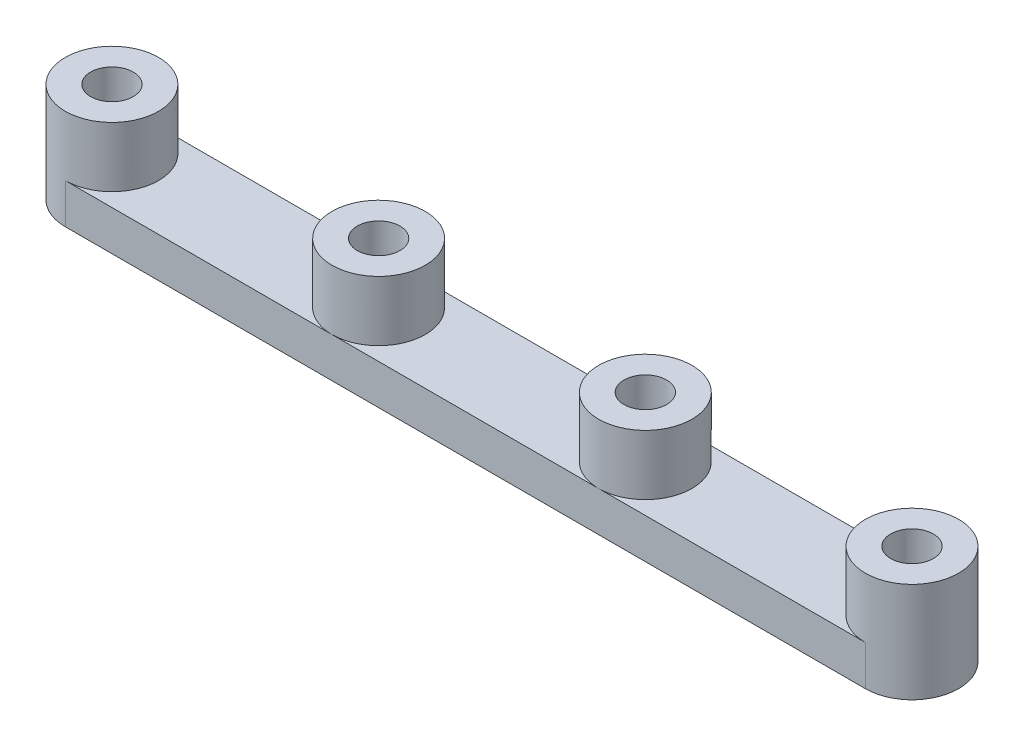
ISO-10303-21;
HEADER;
FILE_DESCRIPTION(('STEP AP214'),'2;1');
FILE_NAME('part.step','',(''),(''),'','','');
FILE_SCHEMA(('AUTOMOTIVE_DESIGN { 1 0 10303 214 1 1 1 1 }'));
ENDSEC;
DATA;
#1=APPLICATION_CONTEXT('core data for automotive mechanical design processes');
#2=APPLICATION_PROTOCOL_DEFINITION('international standard','automotive_design',2000,#1);
#3=PRODUCT_CONTEXT('',#1,'mechanical');
#4=PRODUCT('Part','Part','',(#3));
#5=PRODUCT_RELATED_PRODUCT_CATEGORY('part','',(#4));
#6=PRODUCT_DEFINITION_FORMATION('','',#4);
#7=PRODUCT_DEFINITION_CONTEXT('part definition',#1,'design');
#8=PRODUCT_DEFINITION('design','',#6,#7);
#9=PRODUCT_DEFINITION_SHAPE('','',#8);
#10=(LENGTH_UNIT() NAMED_UNIT(*) SI_UNIT(.MILLI.,.METRE.));
#11=(NAMED_UNIT(*) PLANE_ANGLE_UNIT() SI_UNIT($,.RADIAN.));
#12=(NAMED_UNIT(*) SI_UNIT($,.STERADIAN.) SOLID_ANGLE_UNIT());
#13=UNCERTAINTY_MEASURE_WITH_UNIT(LENGTH_MEASURE(1.E-05),#10,'distance_accuracy_value','');
#14=(GEOMETRIC_REPRESENTATION_CONTEXT(3) GLOBAL_UNCERTAINTY_ASSIGNED_CONTEXT((#13)) GLOBAL_UNIT_ASSIGNED_CONTEXT((#10,
#11,#12)) REPRESENTATION_CONTEXT('',''));
#15=CARTESIAN_POINT('',(0.,0.,0.));
#16=DIRECTION('',(0.,0.,1.));
#17=DIRECTION('',(1.,0.,0.));
#18=AXIS2_PLACEMENT_3D('',#15,#16,#17);
#19=CARTESIAN_POINT('',(30.,3.,0.));
#20=DIRECTION('',(0.,1.,0.));
#21=DIRECTION('',(0.,0.,1.));
#22=AXIS2_PLACEMENT_3D('',#19,#20,#21);
#23=PLANE('',#22);
#24=DIRECTION('',(1.,0.,0.));
#25=VECTOR('',#24,1.);
#26=CARTESIAN_POINT('',(30.,3.,3.49999999999999));
#27=LINE('',#26,#25);
#28=CARTESIAN_POINT('',(10.,3.,3.49999999999999));
#29=VERTEX_POINT('',#28);
#30=CARTESIAN_POINT('',(30.,3.,3.49999999999999));
#31=VERTEX_POINT('',#30);
#32=EDGE_CURVE('E112',#29,#31,#27,.T.);
#33=ORIENTED_EDGE('',*,*,#32,.T.);
#34=CARTESIAN_POINT('',(30.,3.,0.));
#35=DIRECTION('',(0.,1.,0.));
#36=DIRECTION('',(0.,0.,1.));
#37=AXIS2_PLACEMENT_3D('',#34,#35,#36);
#38=CIRCLE('',#37,3.5);
#39=CARTESIAN_POINT('',(30.,3.,-3.50000000000001));
#40=VERTEX_POINT('',#39);
#41=EDGE_CURVE('E100',#40,#31,#38,.T.);
#42=ORIENTED_EDGE('',*,*,#41,.F.);
#43=DIRECTION('',(-1.,0.,0.));
#44=VECTOR('',#43,1.);
#45=CARTESIAN_POINT('',(30.,3.,-3.50000000000001));
#46=LINE('',#45,#44);
#47=CARTESIAN_POINT('',(10.,3.,-3.5));
#48=VERTEX_POINT('',#47);
#49=EDGE_CURVE('E106',#40,#48,#46,.T.);
#50=ORIENTED_EDGE('',*,*,#49,.T.);
#51=CARTESIAN_POINT('',(10.,3.,0.));
#52=DIRECTION('',(0.,1.,0.));
#53=DIRECTION('',(0.,0.,1.));
#54=AXIS2_PLACEMENT_3D('',#51,#52,#53);
#55=CIRCLE('',#54,3.5);
#56=EDGE_CURVE('E137',#29,#48,#55,.T.);
#57=ORIENTED_EDGE('',*,*,#56,.F.);
#58=EDGE_LOOP('',(#33,#42,#50,#57));
#59=FACE_BOUND('',#58,.T.);
#60=ADVANCED_FACE('F41',(#59),#23,.T.);
#61=CARTESIAN_POINT('',(-9.99999999999999,3.,3.5));
#62=VERTEX_POINT('',#61);
#63=EDGE_CURVE('E183',#62,#29,#27,.T.);
#64=ORIENTED_EDGE('',*,*,#63,.T.);
#65=EDGE_CURVE('E56',#48,#29,#55,.T.);
#66=ORIENTED_EDGE('',*,*,#65,.F.);
#67=CARTESIAN_POINT('',(-10.,3.,-3.5));
#68=VERTEX_POINT('',#67);
#69=EDGE_CURVE('E109',#48,#68,#46,.T.);
#70=ORIENTED_EDGE('',*,*,#69,.T.);
#71=CARTESIAN_POINT('',(-10.,3.,0.));
#72=DIRECTION('',(0.,1.,0.));
#73=DIRECTION('',(0.,0.,1.));
#74=AXIS2_PLACEMENT_3D('',#71,#72,#73);
#75=CIRCLE('',#74,3.5);
#76=EDGE_CURVE('E148',#62,#68,#75,.T.);
#77=ORIENTED_EDGE('',*,*,#76,.F.);
#78=EDGE_LOOP('',(#64,#66,#70,#77));
#79=FACE_BOUND('',#78,.T.);
#80=ADVANCED_FACE('F222',(#79),#23,.T.);
#81=CARTESIAN_POINT('',(-30.,3.,3.5));
#82=VERTEX_POINT('',#81);
#83=EDGE_CURVE('E178',#82,#62,#27,.T.);
#84=ORIENTED_EDGE('',*,*,#83,.T.);
#85=EDGE_CURVE('E63',#68,#62,#75,.T.);
#86=ORIENTED_EDGE('',*,*,#85,.F.);
#87=CARTESIAN_POINT('',(-30.,3.,-3.5));
#88=VERTEX_POINT('',#87);
#89=EDGE_CURVE('E114',#68,#88,#46,.T.);
#90=ORIENTED_EDGE('',*,*,#89,.T.);
#91=CARTESIAN_POINT('',(-30.,3.,0.));
#92=DIRECTION('',(0.,1.,0.));
#93=DIRECTION('',(0.,0.,1.));
#94=AXIS2_PLACEMENT_3D('',#91,#92,#93);
#95=CIRCLE('',#94,3.5);
#96=EDGE_CURVE('E154',#82,#88,#95,.T.);
#97=ORIENTED_EDGE('',*,*,#96,.F.);
#98=EDGE_LOOP('',(#84,#86,#90,#97));
#99=FACE_BOUND('',#98,.T.);
#100=ADVANCED_FACE('F217',(#99),#23,.T.);
#101=CARTESIAN_POINT('',(30.,0.,0.));
#102=DIRECTION('',(0.,1.,0.));
#103=DIRECTION('',(0.,0.,1.));
#104=AXIS2_PLACEMENT_3D('',#101,#102,#103);
#105=PLANE('',#104);
#106=CARTESIAN_POINT('',(30.,0.,0.));
#107=DIRECTION('',(0.,1.,0.));
#108=DIRECTION('',(0.,0.,1.));
#109=AXIS2_PLACEMENT_3D('',#106,#107,#108);
#110=CIRCLE('',#109,3.5);
#111=CARTESIAN_POINT('',(30.,0.,3.49999999999999));
#112=VERTEX_POINT('',#111);
#113=CARTESIAN_POINT('',(30.,0.,-3.50000000000001));
#114=VERTEX_POINT('',#113);
#115=EDGE_CURVE('E102',#112,#114,#110,.T.);
#116=ORIENTED_EDGE('',*,*,#115,.F.);
#117=DIRECTION('',(1.,0.,0.));
#118=VECTOR('',#117,1.);
#119=CARTESIAN_POINT('',(30.,0.,3.49999999999999));
#120=LINE('',#119,#118);
#121=CARTESIAN_POINT('',(-30.,0.,3.50000000000001));
#122=VERTEX_POINT('',#121);
#123=EDGE_CURVE('E192',#122,#112,#120,.T.);
#124=ORIENTED_EDGE('',*,*,#123,.F.);
#125=CARTESIAN_POINT('',(-30.,0.,0.));
#126=DIRECTION('',(0.,1.,0.));
#127=DIRECTION('',(0.,0.,1.));
#128=AXIS2_PLACEMENT_3D('',#125,#126,#127);
#129=CIRCLE('',#128,3.5);
#130=CARTESIAN_POINT('',(-30.,0.,-3.5));
#131=VERTEX_POINT('',#130);
#132=EDGE_CURVE('E189',#131,#122,#129,.T.);
#133=ORIENTED_EDGE('',*,*,#132,.F.);
#134=DIRECTION('',(-1.,0.,0.));
#135=VECTOR('',#134,1.);
#136=CARTESIAN_POINT('',(30.,0.,-3.50000000000001));
#137=LINE('',#136,#135);
#138=EDGE_CURVE('E186',#114,#131,#137,.T.);
#139=ORIENTED_EDGE('',*,*,#138,.F.);
#140=EDGE_LOOP('',(#116,#124,#133,#139));
#141=FACE_BOUND('',#140,.T.);
#142=CARTESIAN_POINT('',(-30.,0.,0.));
#143=DIRECTION('',(0.,1.,0.));
#144=DIRECTION('',(0.,0.,1.));
#145=AXIS2_PLACEMENT_3D('',#142,#143,#144);
#146=CIRCLE('',#145,1.6);
#147=CARTESIAN_POINT('',(-30.,0.,1.6));
#148=VERTEX_POINT('',#147);
#149=EDGE_CURVE('E174',#148,#148,#146,.T.);
#150=ORIENTED_EDGE('',*,*,#149,.T.);
#151=EDGE_LOOP('',(#150));
#152=FACE_BOUND('',#151,.T.);
#153=CARTESIAN_POINT('',(-10.,0.,0.));
#154=DIRECTION('',(0.,1.,0.));
#155=DIRECTION('',(0.,0.,1.));
#156=AXIS2_PLACEMENT_3D('',#153,#154,#155);
#157=CIRCLE('',#156,1.6);
#158=CARTESIAN_POINT('',(-10.,0.,1.60000000000001));
#159=VERTEX_POINT('',#158);
#160=EDGE_CURVE('E170',#159,#159,#157,.T.);
#161=ORIENTED_EDGE('',*,*,#160,.T.);
#162=EDGE_LOOP('',(#161));
#163=FACE_BOUND('',#162,.T.);
#164=CARTESIAN_POINT('',(10.,0.,0.));
#165=DIRECTION('',(0.,1.,0.));
#166=DIRECTION('',(0.,0.,1.));
#167=AXIS2_PLACEMENT_3D('',#164,#165,#166);
#168=CIRCLE('',#167,1.6);
#169=CARTESIAN_POINT('',(10.,0.,1.6));
#170=VERTEX_POINT('',#169);
#171=EDGE_CURVE('E166',#170,#170,#168,.T.);
#172=ORIENTED_EDGE('',*,*,#171,.T.);
#173=EDGE_LOOP('',(#172));
#174=FACE_BOUND('',#173,.T.);
#175=CARTESIAN_POINT('',(30.,0.,0.));
#176=DIRECTION('',(0.,1.,0.));
#177=DIRECTION('',(0.,0.,1.));
#178=AXIS2_PLACEMENT_3D('',#175,#176,#177);
#179=CIRCLE('',#178,1.6);
#180=CARTESIAN_POINT('',(30.,0.,1.6));
#181=VERTEX_POINT('',#180);
#182=EDGE_CURVE('E159',#181,#181,#179,.T.);
#183=ORIENTED_EDGE('',*,*,#182,.T.);
#184=EDGE_LOOP('',(#183));
#185=FACE_BOUND('',#184,.T.);
#186=ADVANCED_FACE('F211',(#141,#152,#163,#174,#185),#105,.F.);
#187=CARTESIAN_POINT('',(30.,3.,0.));
#188=DIRECTION('',(0.,-1.,0.));
#189=DIRECTION('',(0.,0.,-1.));
#190=AXIS2_PLACEMENT_3D('',#187,#188,#189);
#191=CYLINDRICAL_SURFACE('',#190,3.5);
#192=ORIENTED_EDGE('',*,*,#115,.T.);
#193=DIRECTION('',(0.,-1.,0.));
#194=VECTOR('',#193,1.);
#195=CARTESIAN_POINT('',(30.,3.,-3.50000000000001));
#196=LINE('',#195,#194);
#197=EDGE_CURVE('E11',#40,#114,#196,.T.);
#198=ORIENTED_EDGE('',*,*,#197,.F.);
#199=ORIENTED_EDGE('',*,*,#41,.T.);
#200=DIRECTION('',(0.,-1.,0.));
#201=VECTOR('',#200,1.);
#202=CARTESIAN_POINT('',(30.,3.,3.49999999999999));
#203=LINE('',#202,#201);
#204=EDGE_CURVE('E182',#31,#112,#203,.T.);
#205=ORIENTED_EDGE('',*,*,#204,.T.);
#206=EDGE_LOOP('',(#192,#198,#199,#205));
#207=FACE_BOUND('',#206,.T.);
#208=CARTESIAN_POINT('',(30.,7.5,0.));
#209=DIRECTION('',(0.,1.,0.));
#210=DIRECTION('',(0.,0.,1.));
#211=AXIS2_PLACEMENT_3D('',#208,#209,#210);
#212=CIRCLE('',#211,3.5);
#213=CARTESIAN_POINT('',(30.,7.5,3.5));
#214=VERTEX_POINT('',#213);
#215=EDGE_CURVE('E118',#214,#214,#212,.T.);
#216=ORIENTED_EDGE('',*,*,#215,.F.);
#217=EDGE_LOOP('',(#216));
#218=FACE_BOUND('',#217,.T.);
#219=ADVANCED_FACE('F43',(#207,#218),#191,.T.);
#220=CARTESIAN_POINT('',(30.,3.,-3.50000000000001));
#221=DIRECTION('',(0.,0.,1.));
#222=DIRECTION('',(1.,0.,0.));
#223=AXIS2_PLACEMENT_3D('',#220,#221,#222);
#224=PLANE('',#223);
#225=ORIENTED_EDGE('',*,*,#138,.T.);
#226=DIRECTION('',(0.,-1.,0.));
#227=VECTOR('',#226,1.);
#228=CARTESIAN_POINT('',(-30.,3.,-3.5));
#229=LINE('',#228,#227);
#230=EDGE_CURVE('E50',#88,#131,#229,.T.);
#231=ORIENTED_EDGE('',*,*,#230,.F.);
#232=ORIENTED_EDGE('',*,*,#89,.F.);
#233=ORIENTED_EDGE('',*,*,#69,.F.);
#234=ORIENTED_EDGE('',*,*,#49,.F.);
#235=ORIENTED_EDGE('',*,*,#197,.T.);
#236=EDGE_LOOP('',(#225,#231,#232,#233,#234,#235));
#237=FACE_BOUND('',#236,.T.);
#238=ADVANCED_FACE('F107',(#237),#224,.F.);
#239=CARTESIAN_POINT('',(-30.,3.,0.));
#240=DIRECTION('',(0.,-1.,0.));
#241=DIRECTION('',(0.,0.,-1.));
#242=AXIS2_PLACEMENT_3D('',#239,#240,#241);
#243=CYLINDRICAL_SURFACE('',#242,3.5);
#244=ORIENTED_EDGE('',*,*,#132,.T.);
#245=DIRECTION('',(0.,-1.,0.));
#246=VECTOR('',#245,1.);
#247=CARTESIAN_POINT('',(-30.,3.,3.50000000000001));
#248=LINE('',#247,#246);
#249=EDGE_CURVE('E197',#82,#122,#248,.T.);
#250=ORIENTED_EDGE('',*,*,#249,.F.);
#251=ORIENTED_EDGE('',*,*,#96,.T.);
#252=ORIENTED_EDGE('',*,*,#230,.T.);
#253=EDGE_LOOP('',(#244,#250,#251,#252));
#254=FACE_BOUND('',#253,.T.);
#255=CARTESIAN_POINT('',(-30.,7.5,0.));
#256=DIRECTION('',(0.,1.,0.));
#257=DIRECTION('',(0.,0.,1.));
#258=AXIS2_PLACEMENT_3D('',#255,#256,#257);
#259=CIRCLE('',#258,3.5);
#260=CARTESIAN_POINT('',(-30.,7.5,3.5));
#261=VERTEX_POINT('',#260);
#262=EDGE_CURVE('E155',#261,#261,#259,.T.);
#263=ORIENTED_EDGE('',*,*,#262,.F.);
#264=EDGE_LOOP('',(#263));
#265=FACE_BOUND('',#264,.T.);
#266=ADVANCED_FACE('F205',(#254,#265),#243,.T.);
#267=CARTESIAN_POINT('',(30.,3.,3.49999999999999));
#268=DIRECTION('',(0.,0.,-1.));
#269=DIRECTION('',(-1.,0.,0.));
#270=AXIS2_PLACEMENT_3D('',#267,#268,#269);
#271=PLANE('',#270);
#272=ORIENTED_EDGE('',*,*,#123,.T.);
#273=ORIENTED_EDGE('',*,*,#204,.F.);
#274=ORIENTED_EDGE('',*,*,#32,.F.);
#275=ORIENTED_EDGE('',*,*,#63,.F.);
#276=ORIENTED_EDGE('',*,*,#83,.F.);
#277=ORIENTED_EDGE('',*,*,#249,.T.);
#278=EDGE_LOOP('',(#272,#273,#274,#275,#276,#277));
#279=FACE_BOUND('',#278,.T.);
#280=ADVANCED_FACE('F214',(#279),#271,.F.);
#281=CARTESIAN_POINT('',(-30.,3.,0.));
#282=DIRECTION('',(0.,-1.,0.));
#283=DIRECTION('',(0.,0.,-1.));
#284=AXIS2_PLACEMENT_3D('',#281,#282,#283);
#285=CYLINDRICAL_SURFACE('',#284,1.6);
#286=ORIENTED_EDGE('',*,*,#149,.F.);
#287=EDGE_LOOP('',(#286));
#288=FACE_BOUND('',#287,.T.);
#289=CARTESIAN_POINT('',(-30.,7.5,0.));
#290=DIRECTION('',(0.,1.,0.));
#291=DIRECTION('',(0.,0.,1.));
#292=AXIS2_PLACEMENT_3D('',#289,#290,#291);
#293=CIRCLE('',#292,1.6);
#294=CARTESIAN_POINT('',(-30.,7.5,1.6));
#295=VERTEX_POINT('',#294);
#296=EDGE_CURVE('E147',#295,#295,#293,.T.);
#297=ORIENTED_EDGE('',*,*,#296,.T.);
#298=EDGE_LOOP('',(#297));
#299=FACE_BOUND('',#298,.T.);
#300=ADVANCED_FACE('F258',(#288,#299),#285,.F.);
#301=CARTESIAN_POINT('',(-10.,3.,0.));
#302=DIRECTION('',(0.,-1.,0.));
#303=DIRECTION('',(0.,0.,-1.));
#304=AXIS2_PLACEMENT_3D('',#301,#302,#303);
#305=CYLINDRICAL_SURFACE('',#304,1.6);
#306=ORIENTED_EDGE('',*,*,#160,.F.);
#307=EDGE_LOOP('',(#306));
#308=FACE_BOUND('',#307,.T.);
#309=CARTESIAN_POINT('',(-10.,7.5,0.));
#310=DIRECTION('',(0.,1.,0.));
#311=DIRECTION('',(0.,0.,1.));
#312=AXIS2_PLACEMENT_3D('',#309,#310,#311);
#313=CIRCLE('',#312,1.6);
#314=CARTESIAN_POINT('',(-10.,7.5,1.60000000000001));
#315=VERTEX_POINT('',#314);
#316=EDGE_CURVE('E136',#315,#315,#313,.T.);
#317=ORIENTED_EDGE('',*,*,#316,.T.);
#318=EDGE_LOOP('',(#317));
#319=FACE_BOUND('',#318,.T.);
#320=ADVANCED_FACE('F279',(#308,#319),#305,.F.);
#321=CARTESIAN_POINT('',(10.,3.,0.));
#322=DIRECTION('',(0.,-1.,0.));
#323=DIRECTION('',(0.,0.,-1.));
#324=AXIS2_PLACEMENT_3D('',#321,#322,#323);
#325=CYLINDRICAL_SURFACE('',#324,1.6);
#326=ORIENTED_EDGE('',*,*,#171,.F.);
#327=EDGE_LOOP('',(#326));
#328=FACE_BOUND('',#327,.T.);
#329=CARTESIAN_POINT('',(10.,7.5,0.));
#330=DIRECTION('',(0.,1.,0.));
#331=DIRECTION('',(0.,0.,1.));
#332=AXIS2_PLACEMENT_3D('',#329,#330,#331);
#333=CIRCLE('',#332,1.6);
#334=CARTESIAN_POINT('',(10.,7.5,1.6));
#335=VERTEX_POINT('',#334);
#336=EDGE_CURVE('E124',#335,#335,#333,.T.);
#337=ORIENTED_EDGE('',*,*,#336,.T.);
#338=EDGE_LOOP('',(#337));
#339=FACE_BOUND('',#338,.T.);
#340=ADVANCED_FACE('F286',(#328,#339),#325,.F.);
#341=CARTESIAN_POINT('',(30.,3.,0.));
#342=DIRECTION('',(0.,-1.,0.));
#343=DIRECTION('',(0.,0.,-1.));
#344=AXIS2_PLACEMENT_3D('',#341,#342,#343);
#345=CYLINDRICAL_SURFACE('',#344,1.6);
#346=ORIENTED_EDGE('',*,*,#182,.F.);
#347=EDGE_LOOP('',(#346));
#348=FACE_BOUND('',#347,.T.);
#349=CARTESIAN_POINT('',(30.,7.5,0.));
#350=DIRECTION('',(0.,1.,0.));
#351=DIRECTION('',(0.,0.,1.));
#352=AXIS2_PLACEMENT_3D('',#349,#350,#351);
#353=CIRCLE('',#352,1.6);
#354=CARTESIAN_POINT('',(30.,7.5,1.6));
#355=VERTEX_POINT('',#354);
#356=EDGE_CURVE('E119',#355,#355,#353,.T.);
#357=ORIENTED_EDGE('',*,*,#356,.T.);
#358=EDGE_LOOP('',(#357));
#359=FACE_BOUND('',#358,.T.);
#360=ADVANCED_FACE('F294',(#348,#359),#345,.F.);
#361=CARTESIAN_POINT('',(-30.,7.5,0.));
#362=DIRECTION('',(0.,1.,0.));
#363=DIRECTION('',(0.,0.,1.));
#364=AXIS2_PLACEMENT_3D('',#361,#362,#363);
#365=PLANE('',#364);
#366=ORIENTED_EDGE('',*,*,#262,.T.);
#367=EDGE_LOOP('',(#366));
#368=FACE_BOUND('',#367,.T.);
#369=ORIENTED_EDGE('',*,*,#296,.F.);
#370=EDGE_LOOP('',(#369));
#371=FACE_BOUND('',#370,.T.);
#372=ADVANCED_FACE('F236',(#368,#371),#365,.T.);
#373=CARTESIAN_POINT('',(-10.,7.5,0.));
#374=DIRECTION('',(0.,1.,0.));
#375=DIRECTION('',(0.,0.,1.));
#376=AXIS2_PLACEMENT_3D('',#373,#374,#375);
#377=PLANE('',#376);
#378=CARTESIAN_POINT('',(-10.,7.5,0.));
#379=DIRECTION('',(0.,1.,0.));
#380=DIRECTION('',(0.,0.,1.));
#381=AXIS2_PLACEMENT_3D('',#378,#379,#380);
#382=CIRCLE('',#381,3.5);
#383=CARTESIAN_POINT('',(-10.,7.5,3.5));
#384=VERTEX_POINT('',#383);
#385=EDGE_CURVE('E143',#384,#384,#382,.T.);
#386=ORIENTED_EDGE('',*,*,#385,.T.);
#387=EDGE_LOOP('',(#386));
#388=FACE_BOUND('',#387,.T.);
#389=ORIENTED_EDGE('',*,*,#316,.F.);
#390=EDGE_LOOP('',(#389));
#391=FACE_BOUND('',#390,.T.);
#392=ADVANCED_FACE('F226',(#388,#391),#377,.T.);
#393=CARTESIAN_POINT('',(-10.,7.5,0.));
#394=DIRECTION('',(0.,-1.,0.));
#395=DIRECTION('',(0.,0.,-1.));
#396=AXIS2_PLACEMENT_3D('',#393,#394,#395);
#397=CYLINDRICAL_SURFACE('',#396,3.5);
#398=ORIENTED_EDGE('',*,*,#385,.F.);
#399=EDGE_LOOP('',(#398));
#400=FACE_BOUND('',#399,.T.);
#401=ORIENTED_EDGE('',*,*,#76,.T.);
#402=ORIENTED_EDGE('',*,*,#85,.T.);
#403=EDGE_LOOP('',(#401,#402));
#404=FACE_BOUND('',#403,.T.);
#405=ADVANCED_FACE('F223',(#400,#404),#397,.T.);
#406=CARTESIAN_POINT('',(10.,7.5,0.));
#407=DIRECTION('',(0.,1.,0.));
#408=DIRECTION('',(0.,0.,1.));
#409=AXIS2_PLACEMENT_3D('',#406,#407,#408);
#410=PLANE('',#409);
#411=CARTESIAN_POINT('',(10.,7.5,0.));
#412=DIRECTION('',(0.,1.,0.));
#413=DIRECTION('',(0.,0.,1.));
#414=AXIS2_PLACEMENT_3D('',#411,#412,#413);
#415=CIRCLE('',#414,3.5);
#416=CARTESIAN_POINT('',(10.,7.5,3.5));
#417=VERTEX_POINT('',#416);
#418=EDGE_CURVE('E132',#417,#417,#415,.T.);
#419=ORIENTED_EDGE('',*,*,#418,.T.);
#420=EDGE_LOOP('',(#419));
#421=FACE_BOUND('',#420,.T.);
#422=ORIENTED_EDGE('',*,*,#336,.F.);
#423=EDGE_LOOP('',(#422));
#424=FACE_BOUND('',#423,.T.);
#425=ADVANCED_FACE('F225',(#421,#424),#410,.T.);
#426=CARTESIAN_POINT('',(10.,7.5,0.));
#427=DIRECTION('',(0.,-1.,0.));
#428=DIRECTION('',(0.,0.,-1.));
#429=AXIS2_PLACEMENT_3D('',#426,#427,#428);
#430=CYLINDRICAL_SURFACE('',#429,3.5);
#431=ORIENTED_EDGE('',*,*,#418,.F.);
#432=EDGE_LOOP('',(#431));
#433=FACE_BOUND('',#432,.T.);
#434=ORIENTED_EDGE('',*,*,#56,.T.);
#435=ORIENTED_EDGE('',*,*,#65,.T.);
#436=EDGE_LOOP('',(#434,#435));
#437=FACE_BOUND('',#436,.T.);
#438=ADVANCED_FACE('F233',(#433,#437),#430,.T.);
#439=CARTESIAN_POINT('',(30.,7.5,0.));
#440=DIRECTION('',(0.,1.,0.));
#441=DIRECTION('',(0.,0.,1.));
#442=AXIS2_PLACEMENT_3D('',#439,#440,#441);
#443=PLANE('',#442);
#444=ORIENTED_EDGE('',*,*,#215,.T.);
#445=EDGE_LOOP('',(#444));
#446=FACE_BOUND('',#445,.T.);
#447=ORIENTED_EDGE('',*,*,#356,.F.);
#448=EDGE_LOOP('',(#447));
#449=FACE_BOUND('',#448,.T.);
#450=ADVANCED_FACE('F332',(#446,#449),#443,.T.);
#451=CLOSED_SHELL('',(#60,#80,#100,#186,#219,#238,#266,#280,#300,#320,#340,#360,#372,#392,#405,
#425,#438,#450));
#452=MANIFOLD_SOLID_BREP('B2',#451);
#453=ADVANCED_BREP_SHAPE_REPRESENTATION('',(#18,#452),#14);
#454=SHAPE_DEFINITION_REPRESENTATION(#9,#453);
ENDSEC;
END-ISO-10303-21;
